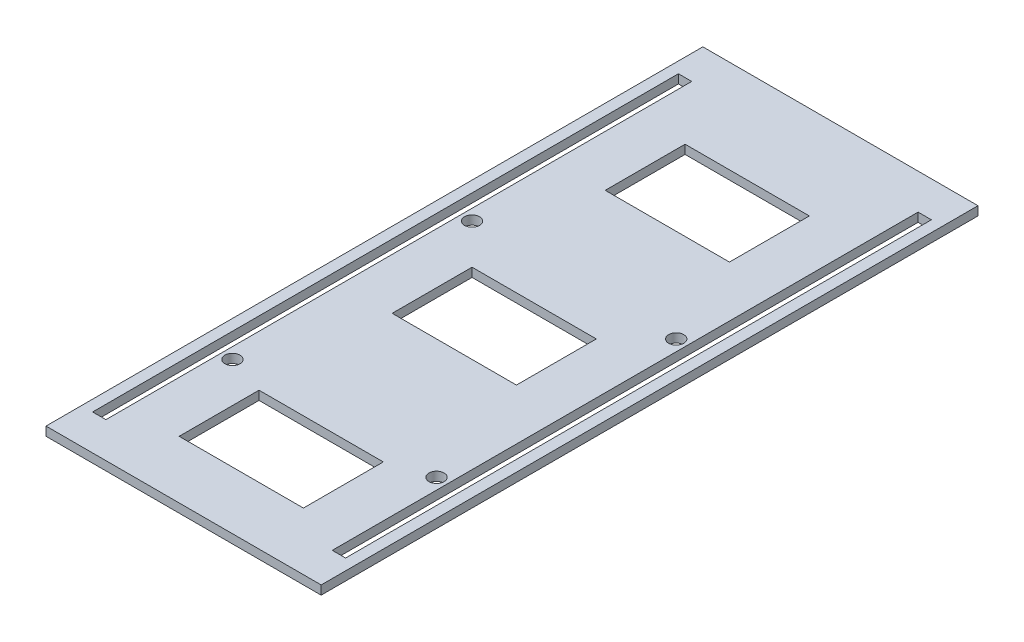
ISO-10303-21;
HEADER;
FILE_DESCRIPTION(('STEP AP214'),'2;1');
FILE_NAME('part.step','',(''),(''),'','','');
FILE_SCHEMA(('AUTOMOTIVE_DESIGN { 1 0 10303 214 1 1 1 1 }'));
ENDSEC;
DATA;
#1=APPLICATION_CONTEXT('core data for automotive mechanical design processes');
#2=APPLICATION_PROTOCOL_DEFINITION('international standard','automotive_design',2000,#1);
#3=PRODUCT_CONTEXT('',#1,'mechanical');
#4=PRODUCT('Part','Part','',(#3));
#5=PRODUCT_RELATED_PRODUCT_CATEGORY('part','',(#4));
#6=PRODUCT_DEFINITION_FORMATION('','',#4);
#7=PRODUCT_DEFINITION_CONTEXT('part definition',#1,'design');
#8=PRODUCT_DEFINITION('design','',#6,#7);
#9=PRODUCT_DEFINITION_SHAPE('','',#8);
#10=(LENGTH_UNIT() NAMED_UNIT(*) SI_UNIT(.MILLI.,.METRE.));
#11=(NAMED_UNIT(*) PLANE_ANGLE_UNIT() SI_UNIT($,.RADIAN.));
#12=(NAMED_UNIT(*) SI_UNIT($,.STERADIAN.) SOLID_ANGLE_UNIT());
#13=UNCERTAINTY_MEASURE_WITH_UNIT(LENGTH_MEASURE(1.E-05),#10,'distance_accuracy_value','');
#14=(GEOMETRIC_REPRESENTATION_CONTEXT(3) GLOBAL_UNCERTAINTY_ASSIGNED_CONTEXT((#13)) GLOBAL_UNIT_ASSIGNED_CONTEXT((#10,
#11,#12)) REPRESENTATION_CONTEXT('',''));
#15=CARTESIAN_POINT('',(0.,0.,0.));
#16=DIRECTION('',(0.,0.,1.));
#17=DIRECTION('',(1.,0.,0.));
#18=AXIS2_PLACEMENT_3D('',#15,#16,#17);
#19=CARTESIAN_POINT('',(23.,19.,-35.));
#20=DIRECTION('',(0.,1.,0.));
#21=DIRECTION('',(1.,0.,0.));
#22=AXIS2_PLACEMENT_3D('',#19,#20,#21);
#23=CYLINDRICAL_SURFACE('',#22,1.7);
#24=CARTESIAN_POINT('',(23.,17.,-35.));
#25=DIRECTION('',(0.,1.,0.));
#26=DIRECTION('',(1.,0.,0.));
#27=AXIS2_PLACEMENT_3D('',#24,#25,#26);
#28=CIRCLE('',#27,1.7);
#29=CARTESIAN_POINT('',(24.7,17.,-35.));
#30=VERTEX_POINT('',#29);
#31=EDGE_CURVE('E481',#30,#30,#28,.T.);
#32=ORIENTED_EDGE('',*,*,#31,.T.);
#33=DIRECTION('',(0.,-1.,0.));
#34=VECTOR('',#33,1.);
#35=CARTESIAN_POINT('',(24.7,19.,-35.));
#36=LINE('',#35,#34);
#37=CARTESIAN_POINT('',(24.7,15.,-35.));
#38=VERTEX_POINT('',#37);
#39=EDGE_CURVE('E11',#30,#38,#36,.T.);
#40=ORIENTED_EDGE('',*,*,#39,.T.);
#41=CARTESIAN_POINT('',(23.,15.,-35.));
#42=DIRECTION('',(0.,1.,0.));
#43=DIRECTION('',(1.,0.,0.));
#44=AXIS2_PLACEMENT_3D('',#41,#42,#43);
#45=CIRCLE('',#44,1.7);
#46=EDGE_CURVE('E395',#38,#38,#45,.T.);
#47=ORIENTED_EDGE('',*,*,#46,.F.);
#48=ORIENTED_EDGE('',*,*,#39,.F.);
#49=EDGE_LOOP('',(#32,#40,#47,#48));
#50=FACE_BOUND('',#49,.T.);
#51=ADVANCED_FACE('F17',(#50),#23,.F.);
#52=CARTESIAN_POINT('',(25.5,14.,-141.));
#53=DIRECTION('',(0.,0.,1.));
#54=DIRECTION('',(1.,0.,0.));
#55=AXIS2_PLACEMENT_3D('',#52,#53,#54);
#56=PLANE('',#55);
#57=DIRECTION('',(0.,1.,0.));
#58=VECTOR('',#57,1.);
#59=CARTESIAN_POINT('',(25.5,14.,-141.));
#60=LINE('',#59,#58);
#61=CARTESIAN_POINT('',(25.5,15.,-141.));
#62=VERTEX_POINT('',#61);
#63=CARTESIAN_POINT('',(25.5,17.,-141.));
#64=VERTEX_POINT('',#63);
#65=EDGE_CURVE('E396',#62,#64,#60,.T.);
#66=ORIENTED_EDGE('',*,*,#65,.F.);
#67=DIRECTION('',(1.,0.,0.));
#68=VECTOR('',#67,1.);
#69=CARTESIAN_POINT('',(-2.75,15.,-141.));
#70=LINE('',#69,#68);
#71=CARTESIAN_POINT('',(28.5,15.,-141.));
#72=VERTEX_POINT('',#71);
#73=EDGE_CURVE('E376',#62,#72,#70,.T.);
#74=ORIENTED_EDGE('',*,*,#73,.T.);
#75=DIRECTION('',(0.,1.,0.));
#76=VECTOR('',#75,1.);
#77=CARTESIAN_POINT('',(28.5,14.,-141.));
#78=LINE('',#77,#76);
#79=CARTESIAN_POINT('',(28.5,17.,-141.));
#80=VERTEX_POINT('',#79);
#81=EDGE_CURVE('E25',#72,#80,#78,.T.);
#82=ORIENTED_EDGE('',*,*,#81,.T.);
#83=DIRECTION('',(1.,0.,0.));
#84=VECTOR('',#83,1.);
#85=CARTESIAN_POINT('',(-2.75,17.,-141.));
#86=LINE('',#85,#84);
#87=EDGE_CURVE('E474',#64,#80,#86,.T.);
#88=ORIENTED_EDGE('',*,*,#87,.F.);
#89=EDGE_LOOP('',(#66,#74,#82,#88));
#90=FACE_BOUND('',#89,.T.);
#91=ADVANCED_FACE('F529',(#90),#56,.T.);
#92=CARTESIAN_POINT('',(28.5,14.,-141.));
#93=DIRECTION('',(1.,0.,0.));
#94=DIRECTION('',(0.,1.,0.));
#95=AXIS2_PLACEMENT_3D('',#92,#93,#94);
#96=PLANE('',#95);
#97=DIRECTION('',(0.,0.,-1.));
#98=VECTOR('',#97,1.);
#99=CARTESIAN_POINT('',(28.5,17.,-145.));
#100=LINE('',#99,#98);
#101=CARTESIAN_POINT('',(28.5,17.,-9.));
#102=VERTEX_POINT('',#101);
#103=EDGE_CURVE('E478',#102,#80,#100,.T.);
#104=ORIENTED_EDGE('',*,*,#103,.T.);
#105=ORIENTED_EDGE('',*,*,#81,.F.);
#106=DIRECTION('',(0.,0.,-1.));
#107=VECTOR('',#106,1.);
#108=CARTESIAN_POINT('',(28.5,15.,-145.));
#109=LINE('',#108,#107);
#110=CARTESIAN_POINT('',(28.5,15.,-9.));
#111=VERTEX_POINT('',#110);
#112=EDGE_CURVE('E372',#111,#72,#109,.T.);
#113=ORIENTED_EDGE('',*,*,#112,.F.);
#114=DIRECTION('',(0.,1.,0.));
#115=VECTOR('',#114,1.);
#116=CARTESIAN_POINT('',(28.5,14.,-9.));
#117=LINE('',#116,#115);
#118=EDGE_CURVE('E507',#111,#102,#117,.T.);
#119=ORIENTED_EDGE('',*,*,#118,.T.);
#120=EDGE_LOOP('',(#104,#105,#113,#119));
#121=FACE_BOUND('',#120,.T.);
#122=ADVANCED_FACE('F524',(#121),#96,.F.);
#123=CARTESIAN_POINT('',(25.5,14.,-141.));
#124=DIRECTION('',(1.,0.,0.));
#125=DIRECTION('',(0.,1.,0.));
#126=AXIS2_PLACEMENT_3D('',#123,#124,#125);
#127=PLANE('',#126);
#128=DIRECTION('',(0.,1.,0.));
#129=VECTOR('',#128,1.);
#130=CARTESIAN_POINT('',(25.5,14.,-9.));
#131=LINE('',#130,#129);
#132=CARTESIAN_POINT('',(25.5,15.,-9.));
#133=VERTEX_POINT('',#132);
#134=CARTESIAN_POINT('',(25.5,17.,-9.));
#135=VERTEX_POINT('',#134);
#136=EDGE_CURVE('E399',#133,#135,#131,.T.);
#137=ORIENTED_EDGE('',*,*,#136,.F.);
#138=DIRECTION('',(0.,0.,-1.));
#139=VECTOR('',#138,1.);
#140=CARTESIAN_POINT('',(25.5,15.,-145.));
#141=LINE('',#140,#139);
#142=EDGE_CURVE('E379',#133,#62,#141,.T.);
#143=ORIENTED_EDGE('',*,*,#142,.T.);
#144=ORIENTED_EDGE('',*,*,#65,.T.);
#145=DIRECTION('',(0.,0.,-1.));
#146=VECTOR('',#145,1.);
#147=CARTESIAN_POINT('',(25.5,17.,-145.));
#148=LINE('',#147,#146);
#149=EDGE_CURVE('E470',#135,#64,#148,.T.);
#150=ORIENTED_EDGE('',*,*,#149,.F.);
#151=EDGE_LOOP('',(#137,#143,#144,#150));
#152=FACE_BOUND('',#151,.T.);
#153=ADVANCED_FACE('F518',(#152),#127,.T.);
#154=CARTESIAN_POINT('',(25.5,14.,-9.));
#155=DIRECTION('',(0.,0.,1.));
#156=DIRECTION('',(1.,0.,0.));
#157=AXIS2_PLACEMENT_3D('',#154,#155,#156);
#158=PLANE('',#157);
#159=DIRECTION('',(1.,0.,0.));
#160=VECTOR('',#159,1.);
#161=CARTESIAN_POINT('',(-2.75,17.,-9.));
#162=LINE('',#161,#160);
#163=EDGE_CURVE('E414',#135,#102,#162,.T.);
#164=ORIENTED_EDGE('',*,*,#163,.T.);
#165=ORIENTED_EDGE('',*,*,#118,.F.);
#166=DIRECTION('',(1.,0.,0.));
#167=VECTOR('',#166,1.);
#168=CARTESIAN_POINT('',(-2.75,15.,-9.));
#169=LINE('',#168,#167);
#170=EDGE_CURVE('E383',#133,#111,#169,.T.);
#171=ORIENTED_EDGE('',*,*,#170,.F.);
#172=ORIENTED_EDGE('',*,*,#136,.T.);
#173=EDGE_LOOP('',(#164,#165,#171,#172));
#174=FACE_BOUND('',#173,.T.);
#175=ADVANCED_FACE('F514',(#174),#158,.F.);
#176=CARTESIAN_POINT('',(-14.,14.,-32.));
#177=DIRECTION('',(0.,0.,1.));
#178=DIRECTION('',(1.,0.,0.));
#179=AXIS2_PLACEMENT_3D('',#176,#177,#178);
#180=PLANE('',#179);
#181=DIRECTION('',(0.,1.,0.));
#182=VECTOR('',#181,1.);
#183=CARTESIAN_POINT('',(-14.,14.,-32.));
#184=LINE('',#183,#182);
#185=CARTESIAN_POINT('',(-14.,15.,-32.));
#186=VERTEX_POINT('',#185);
#187=CARTESIAN_POINT('',(-14.,17.,-32.));
#188=VERTEX_POINT('',#187);
#189=EDGE_CURVE('E424',#186,#188,#184,.T.);
#190=ORIENTED_EDGE('',*,*,#189,.F.);
#191=DIRECTION('',(1.,0.,0.));
#192=VECTOR('',#191,1.);
#193=CARTESIAN_POINT('',(-22.5,15.,-32.));
#194=LINE('',#193,#192);
#195=CARTESIAN_POINT('',(14.,15.,-32.));
#196=VERTEX_POINT('',#195);
#197=EDGE_CURVE('E360',#186,#196,#194,.T.);
#198=ORIENTED_EDGE('',*,*,#197,.T.);
#199=DIRECTION('',(0.,1.,0.));
#200=VECTOR('',#199,1.);
#201=CARTESIAN_POINT('',(14.,14.,-32.));
#202=LINE('',#201,#200);
#203=CARTESIAN_POINT('',(14.,17.,-32.));
#204=VERTEX_POINT('',#203);
#205=EDGE_CURVE('E466',#196,#204,#202,.T.);
#206=ORIENTED_EDGE('',*,*,#205,.T.);
#207=DIRECTION('',(1.,0.,0.));
#208=VECTOR('',#207,1.);
#209=CARTESIAN_POINT('',(-22.5,17.,-32.));
#210=LINE('',#209,#208);
#211=EDGE_CURVE('E334',#188,#204,#210,.T.);
#212=ORIENTED_EDGE('',*,*,#211,.F.);
#213=EDGE_LOOP('',(#190,#198,#206,#212));
#214=FACE_BOUND('',#213,.T.);
#215=ADVANCED_FACE('F542',(#214),#180,.T.);
#216=CARTESIAN_POINT('',(14.,14.,-32.));
#217=DIRECTION('',(1.,0.,0.));
#218=DIRECTION('',(0.,1.,0.));
#219=AXIS2_PLACEMENT_3D('',#216,#217,#218);
#220=PLANE('',#219);
#221=DIRECTION('',(0.,0.,-1.));
#222=VECTOR('',#221,1.);
#223=CARTESIAN_POINT('',(14.,17.,-90.5));
#224=LINE('',#223,#222);
#225=CARTESIAN_POINT('',(14.,17.,-14.));
#226=VERTEX_POINT('',#225);
#227=EDGE_CURVE('E338',#226,#204,#224,.T.);
#228=ORIENTED_EDGE('',*,*,#227,.T.);
#229=ORIENTED_EDGE('',*,*,#205,.F.);
#230=DIRECTION('',(0.,0.,-1.));
#231=VECTOR('',#230,1.);
#232=CARTESIAN_POINT('',(14.,15.,-90.5));
#233=LINE('',#232,#231);
#234=CARTESIAN_POINT('',(14.,15.,-14.));
#235=VERTEX_POINT('',#234);
#236=EDGE_CURVE('E356',#235,#196,#233,.T.);
#237=ORIENTED_EDGE('',*,*,#236,.F.);
#238=DIRECTION('',(0.,1.,0.));
#239=VECTOR('',#238,1.);
#240=CARTESIAN_POINT('',(14.,14.,-14.));
#241=LINE('',#240,#239);
#242=EDGE_CURVE('E425',#235,#226,#241,.T.);
#243=ORIENTED_EDGE('',*,*,#242,.T.);
#244=EDGE_LOOP('',(#228,#229,#237,#243));
#245=FACE_BOUND('',#244,.T.);
#246=ADVANCED_FACE('F545',(#245),#220,.F.);
#247=CARTESIAN_POINT('',(-14.,14.,-32.));
#248=DIRECTION('',(1.,0.,0.));
#249=DIRECTION('',(0.,1.,0.));
#250=AXIS2_PLACEMENT_3D('',#247,#248,#249);
#251=PLANE('',#250);
#252=DIRECTION('',(0.,1.,0.));
#253=VECTOR('',#252,1.);
#254=CARTESIAN_POINT('',(-14.,14.,-14.));
#255=LINE('',#254,#253);
#256=CARTESIAN_POINT('',(-14.,15.,-14.));
#257=VERTEX_POINT('',#256);
#258=CARTESIAN_POINT('',(-14.,17.,-14.));
#259=VERTEX_POINT('',#258);
#260=EDGE_CURVE('E421',#257,#259,#255,.T.);
#261=ORIENTED_EDGE('',*,*,#260,.F.);
#262=DIRECTION('',(0.,0.,-1.));
#263=VECTOR('',#262,1.);
#264=CARTESIAN_POINT('',(-14.,15.,-90.5));
#265=LINE('',#264,#263);
#266=EDGE_CURVE('E364',#257,#186,#265,.T.);
#267=ORIENTED_EDGE('',*,*,#266,.T.);
#268=ORIENTED_EDGE('',*,*,#189,.T.);
#269=DIRECTION('',(0.,0.,-1.));
#270=VECTOR('',#269,1.);
#271=CARTESIAN_POINT('',(-14.,17.,-90.5));
#272=LINE('',#271,#270);
#273=EDGE_CURVE('E339',#259,#188,#272,.T.);
#274=ORIENTED_EDGE('',*,*,#273,.F.);
#275=EDGE_LOOP('',(#261,#267,#268,#274));
#276=FACE_BOUND('',#275,.T.);
#277=ADVANCED_FACE('F547',(#276),#251,.T.);
#278=CARTESIAN_POINT('',(-14.,14.,-14.));
#279=DIRECTION('',(0.,0.,1.));
#280=DIRECTION('',(1.,0.,0.));
#281=AXIS2_PLACEMENT_3D('',#278,#279,#280);
#282=PLANE('',#281);
#283=DIRECTION('',(1.,0.,0.));
#284=VECTOR('',#283,1.);
#285=CARTESIAN_POINT('',(-22.5,17.,-14.));
#286=LINE('',#285,#284);
#287=EDGE_CURVE('E457',#259,#226,#286,.T.);
#288=ORIENTED_EDGE('',*,*,#287,.T.);
#289=ORIENTED_EDGE('',*,*,#242,.F.);
#290=DIRECTION('',(1.,0.,0.));
#291=VECTOR('',#290,1.);
#292=CARTESIAN_POINT('',(-22.5,15.,-14.));
#293=LINE('',#292,#291);
#294=EDGE_CURVE('E368',#257,#235,#293,.T.);
#295=ORIENTED_EDGE('',*,*,#294,.F.);
#296=ORIENTED_EDGE('',*,*,#260,.T.);
#297=EDGE_LOOP('',(#288,#289,#295,#296));
#298=FACE_BOUND('',#297,.T.);
#299=ADVANCED_FACE('F550',(#298),#282,.F.);
#300=CARTESIAN_POINT('',(-14.,14.,-80.));
#301=DIRECTION('',(0.,0.,1.));
#302=DIRECTION('',(1.,0.,0.));
#303=AXIS2_PLACEMENT_3D('',#300,#301,#302);
#304=PLANE('',#303);
#305=DIRECTION('',(0.,1.,0.));
#306=VECTOR('',#305,1.);
#307=CARTESIAN_POINT('',(-14.,14.,-80.));
#308=LINE('',#307,#306);
#309=CARTESIAN_POINT('',(-14.,15.,-80.));
#310=VERTEX_POINT('',#309);
#311=CARTESIAN_POINT('',(-14.,17.,-80.));
#312=VERTEX_POINT('',#311);
#313=EDGE_CURVE('E329',#310,#312,#308,.T.);
#314=ORIENTED_EDGE('',*,*,#313,.F.);
#315=DIRECTION('',(1.,0.,0.));
#316=VECTOR('',#315,1.);
#317=CARTESIAN_POINT('',(-22.5,15.,-80.));
#318=LINE('',#317,#316);
#319=CARTESIAN_POINT('',(14.,15.,-80.));
#320=VERTEX_POINT('',#319);
#321=EDGE_CURVE('E326',#310,#320,#318,.T.);
#322=ORIENTED_EDGE('',*,*,#321,.T.);
#323=DIRECTION('',(0.,1.,0.));
#324=VECTOR('',#323,1.);
#325=CARTESIAN_POINT('',(14.,14.,-80.));
#326=LINE('',#325,#324);
#327=CARTESIAN_POINT('',(14.,17.,-80.));
#328=VERTEX_POINT('',#327);
#329=EDGE_CURVE('E500',#320,#328,#326,.T.);
#330=ORIENTED_EDGE('',*,*,#329,.T.);
#331=DIRECTION('',(1.,0.,0.));
#332=VECTOR('',#331,1.);
#333=CARTESIAN_POINT('',(-22.5,17.,-80.));
#334=LINE('',#333,#332);
#335=EDGE_CURVE('E441',#312,#328,#334,.T.);
#336=ORIENTED_EDGE('',*,*,#335,.F.);
#337=EDGE_LOOP('',(#314,#322,#330,#336));
#338=FACE_BOUND('',#337,.T.);
#339=ADVANCED_FACE('F554',(#338),#304,.T.);
#340=CARTESIAN_POINT('',(14.,14.,-80.));
#341=DIRECTION('',(1.,0.,0.));
#342=DIRECTION('',(0.,1.,0.));
#343=AXIS2_PLACEMENT_3D('',#340,#341,#342);
#344=PLANE('',#343);
#345=DIRECTION('',(0.,0.,-1.));
#346=VECTOR('',#345,1.);
#347=CARTESIAN_POINT('',(14.,17.,-114.5));
#348=LINE('',#347,#346);
#349=CARTESIAN_POINT('',(14.,17.,-62.));
#350=VERTEX_POINT('',#349);
#351=EDGE_CURVE('E445',#350,#328,#348,.T.);
#352=ORIENTED_EDGE('',*,*,#351,.T.);
#353=ORIENTED_EDGE('',*,*,#329,.F.);
#354=DIRECTION('',(0.,0.,-1.));
#355=VECTOR('',#354,1.);
#356=CARTESIAN_POINT('',(14.,15.,-114.5));
#357=LINE('',#356,#355);
#358=CARTESIAN_POINT('',(14.,15.,-62.));
#359=VERTEX_POINT('',#358);
#360=EDGE_CURVE('E322',#359,#320,#357,.T.);
#361=ORIENTED_EDGE('',*,*,#360,.F.);
#362=DIRECTION('',(0.,1.,0.));
#363=VECTOR('',#362,1.);
#364=CARTESIAN_POINT('',(14.,14.,-62.));
#365=LINE('',#364,#363);
#366=EDGE_CURVE('E330',#359,#350,#365,.T.);
#367=ORIENTED_EDGE('',*,*,#366,.T.);
#368=EDGE_LOOP('',(#352,#353,#361,#367));
#369=FACE_BOUND('',#368,.T.);
#370=ADVANCED_FACE('F558',(#369),#344,.F.);
#371=CARTESIAN_POINT('',(-14.,14.,-80.));
#372=DIRECTION('',(1.,0.,0.));
#373=DIRECTION('',(0.,1.,0.));
#374=AXIS2_PLACEMENT_3D('',#371,#372,#373);
#375=PLANE('',#374);
#376=DIRECTION('',(0.,1.,0.));
#377=VECTOR('',#376,1.);
#378=CARTESIAN_POINT('',(-14.,14.,-62.));
#379=LINE('',#378,#377);
#380=CARTESIAN_POINT('',(-14.,15.,-62.));
#381=VERTEX_POINT('',#380);
#382=CARTESIAN_POINT('',(-14.,17.,-62.));
#383=VERTEX_POINT('',#382);
#384=EDGE_CURVE('E327',#381,#383,#379,.T.);
#385=ORIENTED_EDGE('',*,*,#384,.F.);
#386=DIRECTION('',(0.,0.,-1.));
#387=VECTOR('',#386,1.);
#388=CARTESIAN_POINT('',(-14.,15.,-114.5));
#389=LINE('',#388,#387);
#390=EDGE_CURVE('E343',#381,#310,#389,.T.);
#391=ORIENTED_EDGE('',*,*,#390,.T.);
#392=ORIENTED_EDGE('',*,*,#313,.T.);
#393=DIRECTION('',(0.,0.,-1.));
#394=VECTOR('',#393,1.);
#395=CARTESIAN_POINT('',(-14.,17.,-114.5));
#396=LINE('',#395,#394);
#397=EDGE_CURVE('E446',#383,#312,#396,.T.);
#398=ORIENTED_EDGE('',*,*,#397,.F.);
#399=EDGE_LOOP('',(#385,#391,#392,#398));
#400=FACE_BOUND('',#399,.T.);
#401=ADVANCED_FACE('F562',(#400),#375,.T.);
#402=CARTESIAN_POINT('',(-14.,14.,-62.));
#403=DIRECTION('',(0.,0.,1.));
#404=DIRECTION('',(1.,0.,0.));
#405=AXIS2_PLACEMENT_3D('',#402,#403,#404);
#406=PLANE('',#405);
#407=DIRECTION('',(1.,0.,0.));
#408=VECTOR('',#407,1.);
#409=CARTESIAN_POINT('',(-22.5,17.,-62.));
#410=LINE('',#409,#408);
#411=EDGE_CURVE('E450',#383,#350,#410,.T.);
#412=ORIENTED_EDGE('',*,*,#411,.T.);
#413=ORIENTED_EDGE('',*,*,#366,.F.);
#414=DIRECTION('',(1.,0.,0.));
#415=VECTOR('',#414,1.);
#416=CARTESIAN_POINT('',(-22.5,15.,-62.));
#417=LINE('',#416,#415);
#418=EDGE_CURVE('E352',#381,#359,#417,.T.);
#419=ORIENTED_EDGE('',*,*,#418,.F.);
#420=ORIENTED_EDGE('',*,*,#384,.T.);
#421=EDGE_LOOP('',(#412,#413,#419,#420));
#422=FACE_BOUND('',#421,.T.);
#423=ADVANCED_FACE('F566',(#422),#406,.F.);
#424=CARTESIAN_POINT('',(23.,19.,-89.));
#425=DIRECTION('',(0.,1.,0.));
#426=DIRECTION('',(1.,0.,0.));
#427=AXIS2_PLACEMENT_3D('',#424,#425,#426);
#428=CYLINDRICAL_SURFACE('',#427,1.7);
#429=CARTESIAN_POINT('',(23.,17.,-89.));
#430=DIRECTION('',(0.,1.,0.));
#431=DIRECTION('',(1.,0.,0.));
#432=AXIS2_PLACEMENT_3D('',#429,#430,#431);
#433=CIRCLE('',#432,1.7);
#434=CARTESIAN_POINT('',(24.7,17.,-89.));
#435=VERTEX_POINT('',#434);
#436=EDGE_CURVE('E440',#435,#435,#433,.T.);
#437=ORIENTED_EDGE('',*,*,#436,.T.);
#438=DIRECTION('',(0.,-1.,0.));
#439=VECTOR('',#438,1.);
#440=CARTESIAN_POINT('',(24.7,19.,-89.));
#441=LINE('',#440,#439);
#442=CARTESIAN_POINT('',(24.7,15.,-89.));
#443=VERTEX_POINT('',#442);
#444=EDGE_CURVE('E273',#435,#443,#441,.T.);
#445=ORIENTED_EDGE('',*,*,#444,.T.);
#446=CARTESIAN_POINT('',(23.,15.,-89.));
#447=DIRECTION('',(0.,1.,0.));
#448=DIRECTION('',(1.,0.,0.));
#449=AXIS2_PLACEMENT_3D('',#446,#447,#448);
#450=CIRCLE('',#449,1.7);
#451=EDGE_CURVE('E307',#443,#443,#450,.T.);
#452=ORIENTED_EDGE('',*,*,#451,.F.);
#453=ORIENTED_EDGE('',*,*,#444,.F.);
#454=EDGE_LOOP('',(#437,#445,#452,#453));
#455=FACE_BOUND('',#454,.T.);
#456=ADVANCED_FACE('F570',(#455),#428,.F.);
#457=CARTESIAN_POINT('',(-14.,14.,-128.));
#458=DIRECTION('',(0.,0.,1.));
#459=DIRECTION('',(1.,0.,0.));
#460=AXIS2_PLACEMENT_3D('',#457,#458,#459);
#461=PLANE('',#460);
#462=DIRECTION('',(0.,1.,0.));
#463=VECTOR('',#462,1.);
#464=CARTESIAN_POINT('',(-14.,14.,-128.));
#465=LINE('',#464,#463);
#466=CARTESIAN_POINT('',(-14.,15.,-128.));
#467=VERTEX_POINT('',#466);
#468=CARTESIAN_POINT('',(-14.,17.,-128.));
#469=VERTEX_POINT('',#468);
#470=EDGE_CURVE('E274',#467,#469,#465,.T.);
#471=ORIENTED_EDGE('',*,*,#470,.F.);
#472=DIRECTION('',(1.,0.,0.));
#473=VECTOR('',#472,1.);
#474=CARTESIAN_POINT('',(-22.5,15.,-128.));
#475=LINE('',#474,#473);
#476=CARTESIAN_POINT('',(14.,15.,-128.));
#477=VERTEX_POINT('',#476);
#478=EDGE_CURVE('E277',#467,#477,#475,.T.);
#479=ORIENTED_EDGE('',*,*,#478,.T.);
#480=DIRECTION('',(0.,1.,0.));
#481=VECTOR('',#480,1.);
#482=CARTESIAN_POINT('',(14.,14.,-128.));
#483=LINE('',#482,#481);
#484=CARTESIAN_POINT('',(14.,17.,-128.));
#485=VERTEX_POINT('',#484);
#486=EDGE_CURVE('E262',#477,#485,#483,.T.);
#487=ORIENTED_EDGE('',*,*,#486,.T.);
#488=DIRECTION('',(1.,0.,0.));
#489=VECTOR('',#488,1.);
#490=CARTESIAN_POINT('',(-22.5,17.,-128.));
#491=LINE('',#490,#489);
#492=EDGE_CURVE('E388',#469,#485,#491,.T.);
#493=ORIENTED_EDGE('',*,*,#492,.F.);
#494=EDGE_LOOP('',(#471,#479,#487,#493));
#495=FACE_BOUND('',#494,.T.);
#496=ADVANCED_FACE('F278',(#495),#461,.T.);
#497=CARTESIAN_POINT('',(14.,14.,-128.));
#498=DIRECTION('',(1.,0.,0.));
#499=DIRECTION('',(0.,1.,0.));
#500=AXIS2_PLACEMENT_3D('',#497,#498,#499);
#501=PLANE('',#500);
#502=DIRECTION('',(0.,0.,-1.));
#503=VECTOR('',#502,1.);
#504=CARTESIAN_POINT('',(14.,17.,-138.5));
#505=LINE('',#504,#503);
#506=CARTESIAN_POINT('',(14.,17.,-110.));
#507=VERTEX_POINT('',#506);
#508=EDGE_CURVE('E268',#507,#485,#505,.T.);
#509=ORIENTED_EDGE('',*,*,#508,.T.);
#510=ORIENTED_EDGE('',*,*,#486,.F.);
#511=DIRECTION('',(0.,0.,-1.));
#512=VECTOR('',#511,1.);
#513=CARTESIAN_POINT('',(14.,15.,-138.5));
#514=LINE('',#513,#512);
#515=CARTESIAN_POINT('',(14.,15.,-110.));
#516=VERTEX_POINT('',#515);
#517=EDGE_CURVE('E266',#516,#477,#514,.T.);
#518=ORIENTED_EDGE('',*,*,#517,.F.);
#519=DIRECTION('',(0.,1.,0.));
#520=VECTOR('',#519,1.);
#521=CARTESIAN_POINT('',(14.,14.,-110.));
#522=LINE('',#521,#520);
#523=EDGE_CURVE('E300',#516,#507,#522,.T.);
#524=ORIENTED_EDGE('',*,*,#523,.T.);
#525=EDGE_LOOP('',(#509,#510,#518,#524));
#526=FACE_BOUND('',#525,.T.);
#527=ADVANCED_FACE('F264',(#526),#501,.F.);
#528=CARTESIAN_POINT('',(-14.,14.,-128.));
#529=DIRECTION('',(1.,0.,0.));
#530=DIRECTION('',(0.,1.,0.));
#531=AXIS2_PLACEMENT_3D('',#528,#529,#530);
#532=PLANE('',#531);
#533=DIRECTION('',(0.,1.,0.));
#534=VECTOR('',#533,1.);
#535=CARTESIAN_POINT('',(-14.,14.,-110.));
#536=LINE('',#535,#534);
#537=CARTESIAN_POINT('',(-14.,15.,-110.));
#538=VERTEX_POINT('',#537);
#539=CARTESIAN_POINT('',(-14.,17.,-110.));
#540=VERTEX_POINT('',#539);
#541=EDGE_CURVE('E303',#538,#540,#536,.T.);
#542=ORIENTED_EDGE('',*,*,#541,.F.);
#543=DIRECTION('',(0.,0.,-1.));
#544=VECTOR('',#543,1.);
#545=CARTESIAN_POINT('',(-14.,15.,-138.5));
#546=LINE('',#545,#544);
#547=EDGE_CURVE('E283',#538,#467,#546,.T.);
#548=ORIENTED_EDGE('',*,*,#547,.T.);
#549=ORIENTED_EDGE('',*,*,#470,.T.);
#550=DIRECTION('',(0.,0.,-1.));
#551=VECTOR('',#550,1.);
#552=CARTESIAN_POINT('',(-14.,17.,-138.5));
#553=LINE('',#552,#551);
#554=EDGE_CURVE('E391',#540,#469,#553,.T.);
#555=ORIENTED_EDGE('',*,*,#554,.F.);
#556=EDGE_LOOP('',(#542,#548,#549,#555));
#557=FACE_BOUND('',#556,.T.);
#558=ADVANCED_FACE('F574',(#557),#532,.T.);
#559=CARTESIAN_POINT('',(-14.,14.,-110.));
#560=DIRECTION('',(0.,0.,1.));
#561=DIRECTION('',(1.,0.,0.));
#562=AXIS2_PLACEMENT_3D('',#559,#560,#561);
#563=PLANE('',#562);
#564=DIRECTION('',(1.,0.,0.));
#565=VECTOR('',#564,1.);
#566=CARTESIAN_POINT('',(-22.5,17.,-110.));
#567=LINE('',#566,#565);
#568=EDGE_CURVE('E433',#540,#507,#567,.T.);
#569=ORIENTED_EDGE('',*,*,#568,.T.);
#570=ORIENTED_EDGE('',*,*,#523,.F.);
#571=DIRECTION('',(1.,0.,0.));
#572=VECTOR('',#571,1.);
#573=CARTESIAN_POINT('',(-22.5,15.,-110.));
#574=LINE('',#573,#572);
#575=EDGE_CURVE('E289',#538,#516,#574,.T.);
#576=ORIENTED_EDGE('',*,*,#575,.F.);
#577=ORIENTED_EDGE('',*,*,#541,.T.);
#578=EDGE_LOOP('',(#569,#570,#576,#577));
#579=FACE_BOUND('',#578,.T.);
#580=ADVANCED_FACE('F577',(#579),#563,.F.);
#581=CARTESIAN_POINT('',(-23.,19.,-35.));
#582=DIRECTION('',(0.,1.,0.));
#583=DIRECTION('',(1.,0.,0.));
#584=AXIS2_PLACEMENT_3D('',#581,#582,#583);
#585=CYLINDRICAL_SURFACE('',#584,1.7);
#586=CARTESIAN_POINT('',(-23.,17.,-35.));
#587=DIRECTION('',(0.,1.,0.));
#588=DIRECTION('',(1.,0.,0.));
#589=AXIS2_PLACEMENT_3D('',#586,#587,#588);
#590=CIRCLE('',#589,1.7);
#591=CARTESIAN_POINT('',(-21.3,17.,-35.));
#592=VERTEX_POINT('',#591);
#593=EDGE_CURVE('E437',#592,#592,#590,.T.);
#594=ORIENTED_EDGE('',*,*,#593,.T.);
#595=DIRECTION('',(0.,-1.,0.));
#596=VECTOR('',#595,1.);
#597=CARTESIAN_POINT('',(-21.3,19.,-35.));
#598=LINE('',#597,#596);
#599=CARTESIAN_POINT('',(-21.3,15.,-35.));
#600=VERTEX_POINT('',#599);
#601=EDGE_CURVE('E304',#592,#600,#598,.T.);
#602=ORIENTED_EDGE('',*,*,#601,.T.);
#603=CARTESIAN_POINT('',(-23.,15.,-35.));
#604=DIRECTION('',(0.,1.,0.));
#605=DIRECTION('',(1.,0.,0.));
#606=AXIS2_PLACEMENT_3D('',#603,#604,#605);
#607=CIRCLE('',#606,1.7);
#608=EDGE_CURVE('E291',#600,#600,#607,.T.);
#609=ORIENTED_EDGE('',*,*,#608,.F.);
#610=ORIENTED_EDGE('',*,*,#601,.F.);
#611=EDGE_LOOP('',(#594,#602,#609,#610));
#612=FACE_BOUND('',#611,.T.);
#613=ADVANCED_FACE('F579',(#612),#585,.F.);
#614=CARTESIAN_POINT('',(-28.5,14.,-141.));
#615=DIRECTION('',(0.,0.,1.));
#616=DIRECTION('',(1.,0.,0.));
#617=AXIS2_PLACEMENT_3D('',#614,#615,#616);
#618=PLANE('',#617);
#619=DIRECTION('',(0.,1.,0.));
#620=VECTOR('',#619,1.);
#621=CARTESIAN_POINT('',(-28.5,14.,-141.));
#622=LINE('',#621,#620);
#623=CARTESIAN_POINT('',(-28.5,15.,-141.));
#624=VERTEX_POINT('',#623);
#625=CARTESIAN_POINT('',(-28.5,17.,-141.));
#626=VERTEX_POINT('',#625);
#627=EDGE_CURVE('E387',#624,#626,#622,.T.);
#628=ORIENTED_EDGE('',*,*,#627,.F.);
#629=DIRECTION('',(1.,0.,0.));
#630=VECTOR('',#629,1.);
#631=CARTESIAN_POINT('',(-29.75,15.,-141.));
#632=LINE('',#631,#630);
#633=CARTESIAN_POINT('',(-25.5,15.,-141.));
#634=VERTEX_POINT('',#633);
#635=EDGE_CURVE('E687',#624,#634,#632,.T.);
#636=ORIENTED_EDGE('',*,*,#635,.T.);
#637=DIRECTION('',(0.,1.,0.));
#638=VECTOR('',#637,1.);
#639=CARTESIAN_POINT('',(-25.5,14.,-141.));
#640=LINE('',#639,#638);
#641=CARTESIAN_POINT('',(-25.5,17.,-141.));
#642=VERTEX_POINT('',#641);
#643=EDGE_CURVE('E384',#634,#642,#640,.T.);
#644=ORIENTED_EDGE('',*,*,#643,.T.);
#645=DIRECTION('',(1.,0.,0.));
#646=VECTOR('',#645,1.);
#647=CARTESIAN_POINT('',(-29.75,17.,-141.));
#648=LINE('',#647,#646);
#649=EDGE_CURVE('E317',#626,#642,#648,.T.);
#650=ORIENTED_EDGE('',*,*,#649,.F.);
#651=EDGE_LOOP('',(#628,#636,#644,#650));
#652=FACE_BOUND('',#651,.T.);
#653=ADVANCED_FACE('F582',(#652),#618,.T.);
#654=CARTESIAN_POINT('',(-25.5,14.,-141.));
#655=DIRECTION('',(1.,0.,0.));
#656=DIRECTION('',(0.,1.,0.));
#657=AXIS2_PLACEMENT_3D('',#654,#655,#656);
#658=PLANE('',#657);
#659=DIRECTION('',(0.,0.,-1.));
#660=VECTOR('',#659,1.);
#661=CARTESIAN_POINT('',(-25.5,17.,-145.));
#662=LINE('',#661,#660);
#663=CARTESIAN_POINT('',(-25.5,17.,-9.));
#664=VERTEX_POINT('',#663);
#665=EDGE_CURVE('E432',#664,#642,#662,.T.);
#666=ORIENTED_EDGE('',*,*,#665,.T.);
#667=ORIENTED_EDGE('',*,*,#643,.F.);
#668=DIRECTION('',(0.,0.,-1.));
#669=VECTOR('',#668,1.);
#670=CARTESIAN_POINT('',(-25.5,15.,-145.));
#671=LINE('',#670,#669);
#672=CARTESIAN_POINT('',(-25.5,15.,-9.));
#673=VERTEX_POINT('',#672);
#674=EDGE_CURVE('E701',#673,#634,#671,.T.);
#675=ORIENTED_EDGE('',*,*,#674,.F.);
#676=DIRECTION('',(0.,1.,0.));
#677=VECTOR('',#676,1.);
#678=CARTESIAN_POINT('',(-25.5,14.,-9.));
#679=LINE('',#678,#677);
#680=EDGE_CURVE('E311',#673,#664,#679,.T.);
#681=ORIENTED_EDGE('',*,*,#680,.T.);
#682=EDGE_LOOP('',(#666,#667,#675,#681));
#683=FACE_BOUND('',#682,.T.);
#684=ADVANCED_FACE('F584',(#683),#658,.F.);
#685=CARTESIAN_POINT('',(-28.5,14.,-141.));
#686=DIRECTION('',(1.,0.,0.));
#687=DIRECTION('',(0.,1.,0.));
#688=AXIS2_PLACEMENT_3D('',#685,#686,#687);
#689=PLANE('',#688);
#690=DIRECTION('',(0.,1.,0.));
#691=VECTOR('',#690,1.);
#692=CARTESIAN_POINT('',(-28.5,14.,-9.));
#693=LINE('',#692,#691);
#694=CARTESIAN_POINT('',(-28.5,15.,-9.));
#695=VERTEX_POINT('',#694);
#696=CARTESIAN_POINT('',(-28.5,17.,-9.));
#697=VERTEX_POINT('',#696);
#698=EDGE_CURVE('E402',#695,#697,#693,.T.);
#699=ORIENTED_EDGE('',*,*,#698,.F.);
#700=DIRECTION('',(0.,0.,-1.));
#701=VECTOR('',#700,1.);
#702=CARTESIAN_POINT('',(-28.5,15.,-145.));
#703=LINE('',#702,#701);
#704=EDGE_CURVE('E660',#695,#624,#703,.T.);
#705=ORIENTED_EDGE('',*,*,#704,.T.);
#706=ORIENTED_EDGE('',*,*,#627,.T.);
#707=DIRECTION('',(0.,0.,-1.));
#708=VECTOR('',#707,1.);
#709=CARTESIAN_POINT('',(-28.5,17.,-145.));
#710=LINE('',#709,#708);
#711=EDGE_CURVE('E313',#697,#626,#710,.T.);
#712=ORIENTED_EDGE('',*,*,#711,.F.);
#713=EDGE_LOOP('',(#699,#705,#706,#712));
#714=FACE_BOUND('',#713,.T.);
#715=ADVANCED_FACE('F587',(#714),#689,.T.);
#716=CARTESIAN_POINT('',(-28.5,14.,-9.));
#717=DIRECTION('',(0.,0.,1.));
#718=DIRECTION('',(1.,0.,0.));
#719=AXIS2_PLACEMENT_3D('',#716,#717,#718);
#720=PLANE('',#719);
#721=DIRECTION('',(1.,0.,0.));
#722=VECTOR('',#721,1.);
#723=CARTESIAN_POINT('',(-29.75,17.,-9.));
#724=LINE('',#723,#722);
#725=EDGE_CURVE('E318',#697,#664,#724,.T.);
#726=ORIENTED_EDGE('',*,*,#725,.T.);
#727=ORIENTED_EDGE('',*,*,#680,.F.);
#728=DIRECTION('',(1.,0.,0.));
#729=VECTOR('',#728,1.);
#730=CARTESIAN_POINT('',(-29.75,15.,-9.));
#731=LINE('',#730,#729);
#732=EDGE_CURVE('E296',#695,#673,#731,.T.);
#733=ORIENTED_EDGE('',*,*,#732,.F.);
#734=ORIENTED_EDGE('',*,*,#698,.T.);
#735=EDGE_LOOP('',(#726,#727,#733,#734));
#736=FACE_BOUND('',#735,.T.);
#737=ADVANCED_FACE('F594',(#736),#720,.F.);
#738=CARTESIAN_POINT('',(-23.,19.,-89.));
#739=DIRECTION('',(0.,1.,0.));
#740=DIRECTION('',(1.,0.,0.));
#741=AXIS2_PLACEMENT_3D('',#738,#739,#740);
#742=CYLINDRICAL_SURFACE('',#741,1.7);
#743=CARTESIAN_POINT('',(-23.,17.,-89.));
#744=DIRECTION('',(0.,1.,0.));
#745=DIRECTION('',(1.,0.,0.));
#746=AXIS2_PLACEMENT_3D('',#743,#744,#745);
#747=CIRCLE('',#746,1.7);
#748=CARTESIAN_POINT('',(-21.3,17.,-89.));
#749=VERTEX_POINT('',#748);
#750=EDGE_CURVE('E347',#749,#749,#747,.T.);
#751=ORIENTED_EDGE('',*,*,#750,.T.);
#752=DIRECTION('',(0.,-1.,0.));
#753=VECTOR('',#752,1.);
#754=CARTESIAN_POINT('',(-21.3,19.,-89.));
#755=LINE('',#754,#753);
#756=CARTESIAN_POINT('',(-21.3,15.,-89.));
#757=VERTEX_POINT('',#756);
#758=EDGE_CURVE('E308',#749,#757,#755,.T.);
#759=ORIENTED_EDGE('',*,*,#758,.T.);
#760=CARTESIAN_POINT('',(-23.,15.,-89.));
#761=DIRECTION('',(0.,1.,0.));
#762=DIRECTION('',(1.,0.,0.));
#763=AXIS2_PLACEMENT_3D('',#760,#761,#762);
#764=CIRCLE('',#763,1.7);
#765=EDGE_CURVE('E697',#757,#757,#764,.T.);
#766=ORIENTED_EDGE('',*,*,#765,.F.);
#767=ORIENTED_EDGE('',*,*,#758,.F.);
#768=EDGE_LOOP('',(#751,#759,#766,#767));
#769=FACE_BOUND('',#768,.T.);
#770=ADVANCED_FACE('F601',(#769),#742,.F.);
#771=CARTESIAN_POINT('',(31.,15.,-149.));
#772=DIRECTION('',(1.,0.,0.));
#773=DIRECTION('',(0.,1.,0.));
#774=AXIS2_PLACEMENT_3D('',#771,#772,#773);
#775=PLANE('',#774);
#776=DIRECTION('',(0.,0.,1.));
#777=VECTOR('',#776,1.);
#778=CARTESIAN_POINT('',(31.,15.,-149.));
#779=LINE('',#778,#777);
#780=CARTESIAN_POINT('',(31.,15.,-149.));
#781=VERTEX_POINT('',#780);
#782=CARTESIAN_POINT('',(31.,15.,-1.));
#783=VERTEX_POINT('',#782);
#784=EDGE_CURVE('E676',#781,#783,#779,.T.);
#785=ORIENTED_EDGE('',*,*,#784,.F.);
#786=DIRECTION('',(0.,1.,0.));
#787=VECTOR('',#786,1.);
#788=CARTESIAN_POINT('',(31.,15.,-149.));
#789=LINE('',#788,#787);
#790=CARTESIAN_POINT('',(31.,17.,-149.));
#791=VERTEX_POINT('',#790);
#792=EDGE_CURVE('E312',#781,#791,#789,.T.);
#793=ORIENTED_EDGE('',*,*,#792,.T.);
#794=DIRECTION('',(0.,0.,1.));
#795=VECTOR('',#794,1.);
#796=CARTESIAN_POINT('',(31.,17.,-149.));
#797=LINE('',#796,#795);
#798=CARTESIAN_POINT('',(31.,17.,-1.));
#799=VERTEX_POINT('',#798);
#800=EDGE_CURVE('E344',#791,#799,#797,.T.);
#801=ORIENTED_EDGE('',*,*,#800,.T.);
#802=DIRECTION('',(0.,1.,0.));
#803=VECTOR('',#802,1.);
#804=CARTESIAN_POINT('',(31.,15.,-1.));
#805=LINE('',#804,#803);
#806=EDGE_CURVE('E406',#783,#799,#805,.T.);
#807=ORIENTED_EDGE('',*,*,#806,.F.);
#808=EDGE_LOOP('',(#785,#793,#801,#807));
#809=FACE_BOUND('',#808,.T.);
#810=ADVANCED_FACE('F605',(#809),#775,.T.);
#811=CARTESIAN_POINT('',(-31.,15.,-149.));
#812=DIRECTION('',(0.,0.,1.));
#813=DIRECTION('',(1.,0.,0.));
#814=AXIS2_PLACEMENT_3D('',#811,#812,#813);
#815=PLANE('',#814);
#816=DIRECTION('',(1.,0.,0.));
#817=VECTOR('',#816,1.);
#818=CARTESIAN_POINT('',(-31.,17.,-149.));
#819=LINE('',#818,#817);
#820=CARTESIAN_POINT('',(-31.,17.,-149.));
#821=VERTEX_POINT('',#820);
#822=EDGE_CURVE('E348',#821,#791,#819,.T.);
#823=ORIENTED_EDGE('',*,*,#822,.T.);
#824=ORIENTED_EDGE('',*,*,#792,.F.);
#825=DIRECTION('',(1.,0.,0.));
#826=VECTOR('',#825,1.);
#827=CARTESIAN_POINT('',(-31.,15.,-149.));
#828=LINE('',#827,#826);
#829=CARTESIAN_POINT('',(-31.,15.,-149.));
#830=VERTEX_POINT('',#829);
#831=EDGE_CURVE('E675',#830,#781,#828,.T.);
#832=ORIENTED_EDGE('',*,*,#831,.F.);
#833=DIRECTION('',(0.,1.,0.));
#834=VECTOR('',#833,1.);
#835=CARTESIAN_POINT('',(-31.,15.,-149.));
#836=LINE('',#835,#834);
#837=EDGE_CURVE('E654',#830,#821,#836,.T.);
#838=ORIENTED_EDGE('',*,*,#837,.T.);
#839=EDGE_LOOP('',(#823,#824,#832,#838));
#840=FACE_BOUND('',#839,.T.);
#841=ADVANCED_FACE('F607',(#840),#815,.F.);
#842=CARTESIAN_POINT('',(-31.,17.,-149.));
#843=DIRECTION('',(0.,1.,0.));
#844=DIRECTION('',(1.,0.,0.));
#845=AXIS2_PLACEMENT_3D('',#842,#843,#844);
#846=PLANE('',#845);
#847=ORIENTED_EDGE('',*,*,#31,.F.);
#848=EDGE_LOOP('',(#847));
#849=FACE_BOUND('',#848,.T.);
#850=ORIENTED_EDGE('',*,*,#163,.F.);
#851=ORIENTED_EDGE('',*,*,#149,.T.);
#852=ORIENTED_EDGE('',*,*,#87,.T.);
#853=ORIENTED_EDGE('',*,*,#103,.F.);
#854=EDGE_LOOP('',(#850,#851,#852,#853));
#855=FACE_BOUND('',#854,.T.);
#856=ORIENTED_EDGE('',*,*,#287,.F.);
#857=ORIENTED_EDGE('',*,*,#273,.T.);
#858=ORIENTED_EDGE('',*,*,#211,.T.);
#859=ORIENTED_EDGE('',*,*,#227,.F.);
#860=EDGE_LOOP('',(#856,#857,#858,#859));
#861=FACE_BOUND('',#860,.T.);
#862=ORIENTED_EDGE('',*,*,#411,.F.);
#863=ORIENTED_EDGE('',*,*,#397,.T.);
#864=ORIENTED_EDGE('',*,*,#335,.T.);
#865=ORIENTED_EDGE('',*,*,#351,.F.);
#866=EDGE_LOOP('',(#862,#863,#864,#865));
#867=FACE_BOUND('',#866,.T.);
#868=ORIENTED_EDGE('',*,*,#436,.F.);
#869=EDGE_LOOP('',(#868));
#870=FACE_BOUND('',#869,.T.);
#871=ORIENTED_EDGE('',*,*,#568,.F.);
#872=ORIENTED_EDGE('',*,*,#554,.T.);
#873=ORIENTED_EDGE('',*,*,#492,.T.);
#874=ORIENTED_EDGE('',*,*,#508,.F.);
#875=EDGE_LOOP('',(#871,#872,#873,#874));
#876=FACE_BOUND('',#875,.T.);
#877=ORIENTED_EDGE('',*,*,#593,.F.);
#878=EDGE_LOOP('',(#877));
#879=FACE_BOUND('',#878,.T.);
#880=ORIENTED_EDGE('',*,*,#725,.F.);
#881=ORIENTED_EDGE('',*,*,#711,.T.);
#882=ORIENTED_EDGE('',*,*,#649,.T.);
#883=ORIENTED_EDGE('',*,*,#665,.F.);
#884=EDGE_LOOP('',(#880,#881,#882,#883));
#885=FACE_BOUND('',#884,.T.);
#886=ORIENTED_EDGE('',*,*,#750,.F.);
#887=EDGE_LOOP('',(#886));
#888=FACE_BOUND('',#887,.T.);
#889=ORIENTED_EDGE('',*,*,#822,.F.);
#890=DIRECTION('',(0.,0.,1.));
#891=VECTOR('',#890,1.);
#892=CARTESIAN_POINT('',(-31.,17.,-149.));
#893=LINE('',#892,#891);
#894=CARTESIAN_POINT('',(-31.,17.,-1.));
#895=VERTEX_POINT('',#894);
#896=EDGE_CURVE('E644',#821,#895,#893,.T.);
#897=ORIENTED_EDGE('',*,*,#896,.T.);
#898=DIRECTION('',(1.,0.,0.));
#899=VECTOR('',#898,1.);
#900=CARTESIAN_POINT('',(-31.,17.,-1.));
#901=LINE('',#900,#899);
#902=EDGE_CURVE('E410',#895,#799,#901,.T.);
#903=ORIENTED_EDGE('',*,*,#902,.T.);
#904=ORIENTED_EDGE('',*,*,#800,.F.);
#905=EDGE_LOOP('',(#889,#897,#903,#904));
#906=FACE_BOUND('',#905,.T.);
#907=ADVANCED_FACE('F521',(#849,#855,#861,#867,#870,#876,#879,#885,#888,#906),#846,.T.);
#908=CARTESIAN_POINT('',(-31.,15.,-1.));
#909=DIRECTION('',(0.,0.,1.));
#910=DIRECTION('',(1.,0.,0.));
#911=AXIS2_PLACEMENT_3D('',#908,#909,#910);
#912=PLANE('',#911);
#913=DIRECTION('',(0.,1.,0.));
#914=VECTOR('',#913,1.);
#915=CARTESIAN_POINT('',(-31.,15.,-1.));
#916=LINE('',#915,#914);
#917=CARTESIAN_POINT('',(-31.,15.,-1.));
#918=VERTEX_POINT('',#917);
#919=EDGE_CURVE('E641',#918,#895,#916,.T.);
#920=ORIENTED_EDGE('',*,*,#919,.F.);
#921=DIRECTION('',(1.,0.,0.));
#922=VECTOR('',#921,1.);
#923=CARTESIAN_POINT('',(-31.,15.,-1.));
#924=LINE('',#923,#922);
#925=EDGE_CURVE('E672',#918,#783,#924,.T.);
#926=ORIENTED_EDGE('',*,*,#925,.T.);
#927=ORIENTED_EDGE('',*,*,#806,.T.);
#928=ORIENTED_EDGE('',*,*,#902,.F.);
#929=EDGE_LOOP('',(#920,#926,#927,#928));
#930=FACE_BOUND('',#929,.T.);
#931=ADVANCED_FACE('F616',(#930),#912,.T.);
#932=CARTESIAN_POINT('',(-31.,15.,-149.));
#933=DIRECTION('',(0.,1.,0.));
#934=DIRECTION('',(1.,0.,0.));
#935=AXIS2_PLACEMENT_3D('',#932,#933,#934);
#936=PLANE('',#935);
#937=ORIENTED_EDGE('',*,*,#46,.T.);
#938=EDGE_LOOP('',(#937));
#939=FACE_BOUND('',#938,.T.);
#940=ORIENTED_EDGE('',*,*,#112,.T.);
#941=ORIENTED_EDGE('',*,*,#73,.F.);
#942=ORIENTED_EDGE('',*,*,#142,.F.);
#943=ORIENTED_EDGE('',*,*,#170,.T.);
#944=EDGE_LOOP('',(#940,#941,#942,#943));
#945=FACE_BOUND('',#944,.T.);
#946=ORIENTED_EDGE('',*,*,#236,.T.);
#947=ORIENTED_EDGE('',*,*,#197,.F.);
#948=ORIENTED_EDGE('',*,*,#266,.F.);
#949=ORIENTED_EDGE('',*,*,#294,.T.);
#950=EDGE_LOOP('',(#946,#947,#948,#949));
#951=FACE_BOUND('',#950,.T.);
#952=ORIENTED_EDGE('',*,*,#360,.T.);
#953=ORIENTED_EDGE('',*,*,#321,.F.);
#954=ORIENTED_EDGE('',*,*,#390,.F.);
#955=ORIENTED_EDGE('',*,*,#418,.T.);
#956=EDGE_LOOP('',(#952,#953,#954,#955));
#957=FACE_BOUND('',#956,.T.);
#958=ORIENTED_EDGE('',*,*,#451,.T.);
#959=EDGE_LOOP('',(#958));
#960=FACE_BOUND('',#959,.T.);
#961=ORIENTED_EDGE('',*,*,#517,.T.);
#962=ORIENTED_EDGE('',*,*,#478,.F.);
#963=ORIENTED_EDGE('',*,*,#547,.F.);
#964=ORIENTED_EDGE('',*,*,#575,.T.);
#965=EDGE_LOOP('',(#961,#962,#963,#964));
#966=FACE_BOUND('',#965,.T.);
#967=ORIENTED_EDGE('',*,*,#608,.T.);
#968=EDGE_LOOP('',(#967));
#969=FACE_BOUND('',#968,.T.);
#970=ORIENTED_EDGE('',*,*,#674,.T.);
#971=ORIENTED_EDGE('',*,*,#635,.F.);
#972=ORIENTED_EDGE('',*,*,#704,.F.);
#973=ORIENTED_EDGE('',*,*,#732,.T.);
#974=EDGE_LOOP('',(#970,#971,#972,#973));
#975=FACE_BOUND('',#974,.T.);
#976=ORIENTED_EDGE('',*,*,#765,.T.);
#977=EDGE_LOOP('',(#976));
#978=FACE_BOUND('',#977,.T.);
#979=ORIENTED_EDGE('',*,*,#784,.T.);
#980=ORIENTED_EDGE('',*,*,#925,.F.);
#981=DIRECTION('',(0.,0.,1.));
#982=VECTOR('',#981,1.);
#983=CARTESIAN_POINT('',(-31.,15.,-149.));
#984=LINE('',#983,#982);
#985=EDGE_CURVE('E646',#830,#918,#984,.T.);
#986=ORIENTED_EDGE('',*,*,#985,.F.);
#987=ORIENTED_EDGE('',*,*,#831,.T.);
#988=EDGE_LOOP('',(#979,#980,#986,#987));
#989=FACE_BOUND('',#988,.T.);
#990=ADVANCED_FACE('F286',(#939,#945,#951,#957,#960,#966,#969,#975,#978,#989),#936,.F.);
#991=CARTESIAN_POINT('',(-31.,15.,-149.));
#992=DIRECTION('',(1.,0.,0.));
#993=DIRECTION('',(0.,1.,0.));
#994=AXIS2_PLACEMENT_3D('',#991,#992,#993);
#995=PLANE('',#994);
#996=ORIENTED_EDGE('',*,*,#919,.T.);
#997=ORIENTED_EDGE('',*,*,#896,.F.);
#998=ORIENTED_EDGE('',*,*,#837,.F.);
#999=ORIENTED_EDGE('',*,*,#985,.T.);
#1000=EDGE_LOOP('',(#996,#997,#998,#999));
#1001=FACE_BOUND('',#1000,.T.);
#1002=ADVANCED_FACE('F628',(#1001),#995,.F.);
#1003=CLOSED_SHELL('',(#51,#91,#122,#153,#175,#215,#246,#277,#299,#339,#370,#401,#423,#456,#496,
#527,#558,#580,#613,#653,#684,#715,#737,#770,#810,#841,#907,#931,#990,#1002));
#1004=MANIFOLD_SOLID_BREP('B1',#1003);
#1005=ADVANCED_BREP_SHAPE_REPRESENTATION('',(#18,#1004),#14);
#1006=SHAPE_DEFINITION_REPRESENTATION(#9,#1005);
ENDSEC;
END-ISO-10303-21;
